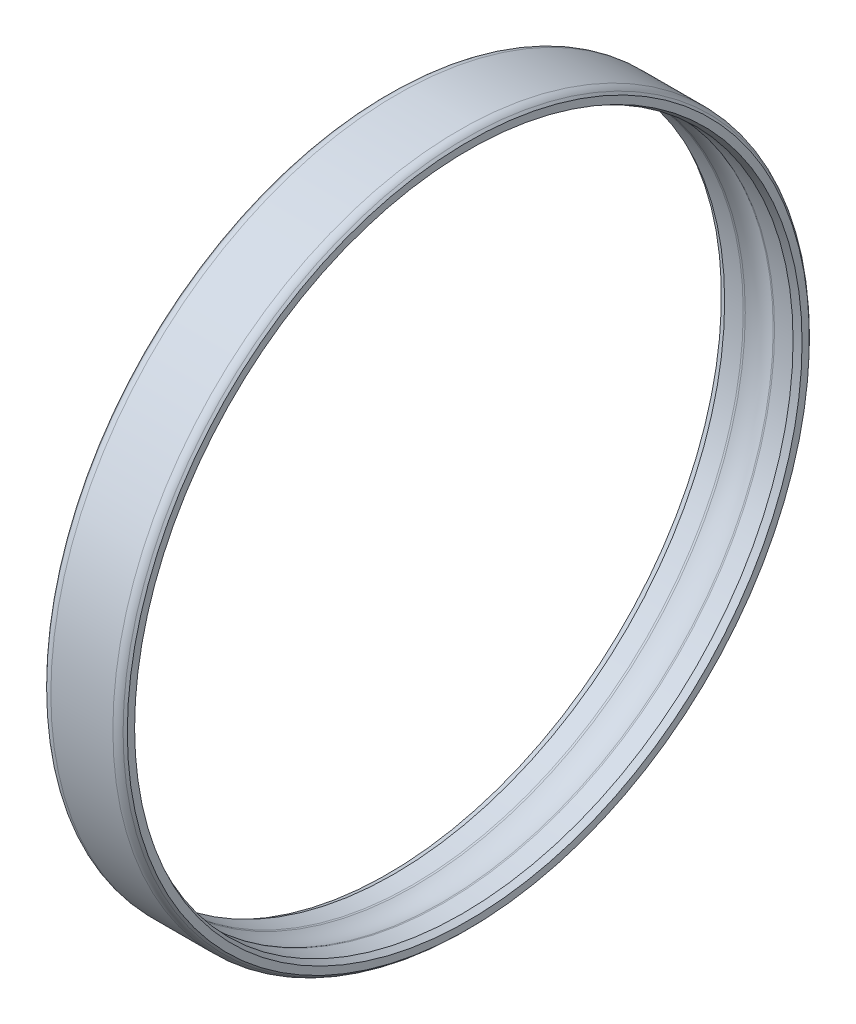
ISO-10303-21;
HEADER;
FILE_DESCRIPTION(('STEP AP214'),'2;1');
FILE_NAME('part.step','',(''),(''),'','','');
FILE_SCHEMA(('AUTOMOTIVE_DESIGN { 1 0 10303 214 1 1 1 1 }'));
ENDSEC;
DATA;
#1=APPLICATION_CONTEXT('core data for automotive mechanical design processes');
#2=APPLICATION_PROTOCOL_DEFINITION('international standard','automotive_design',2000,#1);
#3=PRODUCT_CONTEXT('',#1,'mechanical');
#4=PRODUCT('Part','Part','',(#3));
#5=PRODUCT_RELATED_PRODUCT_CATEGORY('part','',(#4));
#6=PRODUCT_DEFINITION_FORMATION('','',#4);
#7=PRODUCT_DEFINITION_CONTEXT('part definition',#1,'design');
#8=PRODUCT_DEFINITION('design','',#6,#7);
#9=PRODUCT_DEFINITION_SHAPE('','',#8);
#10=(LENGTH_UNIT() NAMED_UNIT(*) SI_UNIT(.MILLI.,.METRE.));
#11=(NAMED_UNIT(*) PLANE_ANGLE_UNIT() SI_UNIT($,.RADIAN.));
#12=(NAMED_UNIT(*) SI_UNIT($,.STERADIAN.) SOLID_ANGLE_UNIT());
#13=UNCERTAINTY_MEASURE_WITH_UNIT(LENGTH_MEASURE(1.E-05),#10,'distance_accuracy_value','');
#14=(GEOMETRIC_REPRESENTATION_CONTEXT(3) GLOBAL_UNCERTAINTY_ASSIGNED_CONTEXT((#13)) GLOBAL_UNIT_ASSIGNED_CONTEXT((#10,
#11,#12)) REPRESENTATION_CONTEXT('',''));
#15=CARTESIAN_POINT('',(0.,0.,0.));
#16=DIRECTION('',(0.,0.,1.));
#17=DIRECTION('',(1.,0.,0.));
#18=AXIS2_PLACEMENT_3D('',#15,#16,#17);
#19=CARTESIAN_POINT('',(1.975,0.,0.));
#20=DIRECTION('',(1.,0.,0.));
#21=DIRECTION('',(0.,0.,-1.));
#22=AXIS2_PLACEMENT_3D('',#19,#20,#21);
#23=CONICAL_SURFACE('',#22,16.3403922974465,0.436332312500002);
#24=CARTESIAN_POINT('',(1.975,0.,0.));
#25=DIRECTION('',(-1.,0.,0.));
#26=DIRECTION('',(0.,0.,1.));
#27=AXIS2_PLACEMENT_3D('',#24,#25,#26);
#28=CIRCLE('',#27,16.3403922974465);
#29=CARTESIAN_POINT('',(1.975,0.,16.3403922974465));
#30=VERTEX_POINT('',#29);
#31=EDGE_CURVE('E11',#30,#30,#28,.T.);
#32=ORIENTED_EDGE('',*,*,#31,.F.);
#33=EDGE_LOOP('',(#32));
#34=FACE_BOUND('',#33,.T.);
#35=CARTESIAN_POINT('',(1.675,0.,0.));
#36=DIRECTION('',(-1.,0.,0.));
#37=DIRECTION('',(0.,0.,-1.));
#38=AXIS2_PLACEMENT_3D('',#35,#36,#37);
#39=CIRCLE('',#38,16.2005);
#40=CARTESIAN_POINT('',(1.675,0.,-16.2005));
#41=VERTEX_POINT('',#40);
#42=EDGE_CURVE('E126',#41,#41,#39,.T.);
#43=ORIENTED_EDGE('',*,*,#42,.T.);
#44=EDGE_LOOP('',(#43));
#45=FACE_BOUND('',#44,.T.);
#46=ADVANCED_FACE('F17',(#34,#45),#23,.F.);
#47=CARTESIAN_POINT('',(1.975,16.698,0.));
#48=DIRECTION('',(1.,0.,0.));
#49=DIRECTION('',(0.,1.,0.));
#50=AXIS2_PLACEMENT_3D('',#47,#48,#49);
#51=PLANE('',#50);
#52=CARTESIAN_POINT('',(1.975,0.,0.));
#53=DIRECTION('',(-1.,0.,0.));
#54=DIRECTION('',(0.,0.,1.));
#55=AXIS2_PLACEMENT_3D('',#52,#53,#54);
#56=CIRCLE('',#55,16.698);
#57=CARTESIAN_POINT('',(1.975,0.,16.698));
#58=VERTEX_POINT('',#57);
#59=EDGE_CURVE('E20',#58,#58,#56,.T.);
#60=ORIENTED_EDGE('',*,*,#59,.F.);
#61=EDGE_LOOP('',(#60));
#62=FACE_BOUND('',#61,.T.);
#63=ORIENTED_EDGE('',*,*,#31,.T.);
#64=EDGE_LOOP('',(#63));
#65=FACE_BOUND('',#64,.T.);
#66=ADVANCED_FACE('F196',(#62,#65),#51,.T.);
#67=CARTESIAN_POINT('',(1.87144660940673,0.,0.));
#68=DIRECTION('',(-1.,0.,0.));
#69=DIRECTION('',(0.,0.,1.));
#70=AXIS2_PLACEMENT_3D('',#67,#68,#69);
#71=CONICAL_SURFACE('',#70,16.8015533905933,0.785398162500012);
#72=CARTESIAN_POINT('',(1.87144660940673,0.,0.));
#73=DIRECTION('',(-1.,0.,0.));
#74=DIRECTION('',(0.,0.,1.));
#75=AXIS2_PLACEMENT_3D('',#72,#73,#74);
#76=CIRCLE('',#75,16.8015533905933);
#77=CARTESIAN_POINT('',(1.87144660940673,0.,16.8015533905933));
#78=VERTEX_POINT('',#77);
#79=EDGE_CURVE('E95',#78,#78,#76,.T.);
#80=ORIENTED_EDGE('',*,*,#79,.F.);
#81=EDGE_LOOP('',(#80));
#82=FACE_BOUND('',#81,.T.);
#83=ORIENTED_EDGE('',*,*,#59,.T.);
#84=EDGE_LOOP('',(#83));
#85=FACE_BOUND('',#84,.T.);
#86=ADVANCED_FACE('F192',(#82,#85),#71,.T.);
#87=CARTESIAN_POINT('',(1.51789321881345,0.,0.));
#88=DIRECTION('',(-1.,0.,0.));
#89=DIRECTION('',(0.,0.,1.));
#90=AXIS2_PLACEMENT_3D('',#87,#88,#89);
#91=TOROIDAL_SURFACE('',#90,16.448,0.5);
#92=CARTESIAN_POINT('',(1.51789321881345,0.,0.));
#93=DIRECTION('',(-1.,0.,0.));
#94=DIRECTION('',(0.,0.,1.));
#95=AXIS2_PLACEMENT_3D('',#92,#93,#94);
#96=CIRCLE('',#95,16.948);
#97=CARTESIAN_POINT('',(1.51789321881345,0.,16.948));
#98=VERTEX_POINT('',#97);
#99=EDGE_CURVE('E91',#98,#98,#96,.T.);
#100=ORIENTED_EDGE('',*,*,#99,.F.);
#101=EDGE_LOOP('',(#100));
#102=FACE_BOUND('',#101,.T.);
#103=ORIENTED_EDGE('',*,*,#79,.T.);
#104=EDGE_LOOP('',(#103));
#105=FACE_BOUND('',#104,.T.);
#106=ADVANCED_FACE('F185',(#102,#105),#91,.T.);
#107=CARTESIAN_POINT('',(0.,0.,0.));
#108=DIRECTION('',(-1.,0.,0.));
#109=DIRECTION('',(0.,0.,1.));
#110=AXIS2_PLACEMENT_3D('',#107,#108,#109);
#111=CYLINDRICAL_SURFACE('',#110,16.948);
#112=CARTESIAN_POINT('',(-1.51789321881345,0.,0.));
#113=DIRECTION('',(-1.,0.,0.));
#114=DIRECTION('',(0.,0.,1.));
#115=AXIS2_PLACEMENT_3D('',#112,#113,#114);
#116=CIRCLE('',#115,16.948);
#117=CARTESIAN_POINT('',(-1.51789321881345,0.,16.948));
#118=VERTEX_POINT('',#117);
#119=EDGE_CURVE('E96',#118,#118,#116,.T.);
#120=ORIENTED_EDGE('',*,*,#119,.F.);
#121=EDGE_LOOP('',(#120));
#122=FACE_BOUND('',#121,.T.);
#123=ORIENTED_EDGE('',*,*,#99,.T.);
#124=EDGE_LOOP('',(#123));
#125=FACE_BOUND('',#124,.T.);
#126=ADVANCED_FACE('F92',(#122,#125),#111,.T.);
#127=CARTESIAN_POINT('',(-1.51789321881345,0.,0.));
#128=DIRECTION('',(-1.,0.,0.));
#129=DIRECTION('',(0.,0.,1.));
#130=AXIS2_PLACEMENT_3D('',#127,#128,#129);
#131=TOROIDAL_SURFACE('',#130,16.448,0.5);
#132=CARTESIAN_POINT('',(-1.87144660940673,0.,0.));
#133=DIRECTION('',(-1.,0.,0.));
#134=DIRECTION('',(0.,0.,1.));
#135=AXIS2_PLACEMENT_3D('',#132,#133,#134);
#136=CIRCLE('',#135,16.8015533905933);
#137=CARTESIAN_POINT('',(-1.87144660940673,0.,16.8015533905933));
#138=VERTEX_POINT('',#137);
#139=EDGE_CURVE('E102',#138,#138,#136,.T.);
#140=ORIENTED_EDGE('',*,*,#139,.F.);
#141=EDGE_LOOP('',(#140));
#142=FACE_BOUND('',#141,.T.);
#143=ORIENTED_EDGE('',*,*,#119,.T.);
#144=EDGE_LOOP('',(#143));
#145=FACE_BOUND('',#144,.T.);
#146=ADVANCED_FACE('F175',(#142,#145),#131,.T.);
#147=CARTESIAN_POINT('',(-1.975,0.,0.));
#148=DIRECTION('',(1.,0.,0.));
#149=DIRECTION('',(0.,0.,-1.));
#150=AXIS2_PLACEMENT_3D('',#147,#148,#149);
#151=CONICAL_SURFACE('',#150,16.698,0.7853981625);
#152=CARTESIAN_POINT('',(-1.975,0.,0.));
#153=DIRECTION('',(-1.,0.,0.));
#154=DIRECTION('',(0.,0.,1.));
#155=AXIS2_PLACEMENT_3D('',#152,#153,#154);
#156=CIRCLE('',#155,16.698);
#157=CARTESIAN_POINT('',(-1.975,0.,16.698));
#158=VERTEX_POINT('',#157);
#159=EDGE_CURVE('E107',#158,#158,#156,.T.);
#160=ORIENTED_EDGE('',*,*,#159,.F.);
#161=EDGE_LOOP('',(#160));
#162=FACE_BOUND('',#161,.T.);
#163=ORIENTED_EDGE('',*,*,#139,.T.);
#164=EDGE_LOOP('',(#163));
#165=FACE_BOUND('',#164,.T.);
#166=ADVANCED_FACE('F169',(#162,#165),#151,.T.);
#167=CARTESIAN_POINT('',(-1.975,16.3403922974465,0.));
#168=DIRECTION('',(-1.,0.,0.));
#169=DIRECTION('',(0.,0.,1.));
#170=AXIS2_PLACEMENT_3D('',#167,#168,#169);
#171=PLANE('',#170);
#172=CARTESIAN_POINT('',(-1.975,0.,0.));
#173=DIRECTION('',(-1.,0.,0.));
#174=DIRECTION('',(0.,0.,1.));
#175=AXIS2_PLACEMENT_3D('',#172,#173,#174);
#176=CIRCLE('',#175,16.3403922974465);
#177=CARTESIAN_POINT('',(-1.975,0.,16.3403922974465));
#178=VERTEX_POINT('',#177);
#179=EDGE_CURVE('E108',#178,#178,#176,.T.);
#180=ORIENTED_EDGE('',*,*,#179,.F.);
#181=EDGE_LOOP('',(#180));
#182=FACE_BOUND('',#181,.T.);
#183=ORIENTED_EDGE('',*,*,#159,.T.);
#184=EDGE_LOOP('',(#183));
#185=FACE_BOUND('',#184,.T.);
#186=ADVANCED_FACE('F163',(#182,#185),#171,.T.);
#187=CARTESIAN_POINT('',(-1.675,0.,0.));
#188=DIRECTION('',(-1.,0.,0.));
#189=DIRECTION('',(0.,0.,1.));
#190=AXIS2_PLACEMENT_3D('',#187,#188,#189);
#191=CONICAL_SURFACE('',#190,16.2005,0.436332312500002);
#192=CARTESIAN_POINT('',(-1.675,0.,0.));
#193=DIRECTION('',(-1.,0.,0.));
#194=DIRECTION('',(0.,0.,1.));
#195=AXIS2_PLACEMENT_3D('',#192,#193,#194);
#196=CIRCLE('',#195,16.2005);
#197=CARTESIAN_POINT('',(-1.675,0.,16.2005));
#198=VERTEX_POINT('',#197);
#199=EDGE_CURVE('E111',#198,#198,#196,.T.);
#200=ORIENTED_EDGE('',*,*,#199,.F.);
#201=EDGE_LOOP('',(#200));
#202=FACE_BOUND('',#201,.T.);
#203=ORIENTED_EDGE('',*,*,#179,.T.);
#204=EDGE_LOOP('',(#203));
#205=FACE_BOUND('',#204,.T.);
#206=ADVANCED_FACE('F157',(#202,#205),#191,.F.);
#207=CARTESIAN_POINT('',(0.,0.,0.));
#208=DIRECTION('',(-1.,0.,0.));
#209=DIRECTION('',(0.,0.,1.));
#210=AXIS2_PLACEMENT_3D('',#207,#208,#209);
#211=CYLINDRICAL_SURFACE('',#210,16.2005);
#212=CARTESIAN_POINT('',(-0.765881844673186,0.,0.));
#213=DIRECTION('',(-1.,0.,0.));
#214=DIRECTION('',(0.,0.,1.));
#215=AXIS2_PLACEMENT_3D('',#212,#213,#214);
#216=CIRCLE('',#215,16.2005);
#217=CARTESIAN_POINT('',(-0.765881844673186,0.,16.2005));
#218=VERTEX_POINT('',#217);
#219=EDGE_CURVE('E114',#218,#218,#216,.T.);
#220=ORIENTED_EDGE('',*,*,#219,.F.);
#221=EDGE_LOOP('',(#220));
#222=FACE_BOUND('',#221,.T.);
#223=ORIENTED_EDGE('',*,*,#199,.T.);
#224=EDGE_LOOP('',(#223));
#225=FACE_BOUND('',#224,.T.);
#226=ADVANCED_FACE('F151',(#222,#225),#211,.F.);
#227=CARTESIAN_POINT('',(-0.765881844673186,0.,0.));
#228=DIRECTION('',(-1.,0.,0.));
#229=DIRECTION('',(0.,0.,1.));
#230=AXIS2_PLACEMENT_3D('',#227,#228,#229);
#231=TOROIDAL_SURFACE('',#230,16.4005,0.2);
#232=CARTESIAN_POINT('',(-0.683528958149188,0.,0.));
#233=DIRECTION('',(-1.,0.,0.));
#234=DIRECTION('',(0.,0.,1.));
#235=AXIS2_PLACEMENT_3D('',#232,#233,#234);
#236=CIRCLE('',#235,16.2182419354839);
#237=CARTESIAN_POINT('',(-0.683528958149188,0.,16.2182419354839));
#238=VERTEX_POINT('',#237);
#239=EDGE_CURVE('E116',#238,#238,#236,.T.);
#240=ORIENTED_EDGE('',*,*,#239,.F.);
#241=EDGE_LOOP('',(#240));
#242=FACE_BOUND('',#241,.T.);
#243=ORIENTED_EDGE('',*,*,#219,.T.);
#244=EDGE_LOOP('',(#243));
#245=FACE_BOUND('',#244,.T.);
#246=ADVANCED_FACE('F145',(#242,#245),#231,.T.);
#247=CARTESIAN_POINT('',(0.,0.,0.));
#248=DIRECTION('',(-1.,0.,0.));
#249=DIRECTION('',(0.,0.,1.));
#250=AXIS2_PLACEMENT_3D('',#247,#248,#249);
#251=TOROIDAL_SURFACE('',#250,14.7055,1.66);
#252=CARTESIAN_POINT('',(0.683528958149188,0.,0.));
#253=DIRECTION('',(-1.,0.,0.));
#254=DIRECTION('',(0.,0.,1.));
#255=AXIS2_PLACEMENT_3D('',#252,#253,#254);
#256=CIRCLE('',#255,16.2182419354839);
#257=CARTESIAN_POINT('',(0.683528958149188,0.,16.2182419354839));
#258=VERTEX_POINT('',#257);
#259=EDGE_CURVE('E120',#258,#258,#256,.T.);
#260=ORIENTED_EDGE('',*,*,#259,.F.);
#261=EDGE_LOOP('',(#260));
#262=FACE_BOUND('',#261,.T.);
#263=ORIENTED_EDGE('',*,*,#239,.T.);
#264=EDGE_LOOP('',(#263));
#265=FACE_BOUND('',#264,.T.);
#266=ADVANCED_FACE('F139',(#262,#265),#251,.F.);
#267=CARTESIAN_POINT('',(0.765881844673186,0.,0.));
#268=DIRECTION('',(-1.,0.,0.));
#269=DIRECTION('',(0.,0.,1.));
#270=AXIS2_PLACEMENT_3D('',#267,#268,#269);
#271=TOROIDAL_SURFACE('',#270,16.4005,0.2);
#272=CARTESIAN_POINT('',(0.765881844673186,0.,0.));
#273=DIRECTION('',(-1.,0.,0.));
#274=DIRECTION('',(0.,0.,1.));
#275=AXIS2_PLACEMENT_3D('',#272,#273,#274);
#276=CIRCLE('',#275,16.2005);
#277=CARTESIAN_POINT('',(0.765881844673186,0.,16.2005));
#278=VERTEX_POINT('',#277);
#279=EDGE_CURVE('E123',#278,#278,#276,.T.);
#280=ORIENTED_EDGE('',*,*,#279,.F.);
#281=EDGE_LOOP('',(#280));
#282=FACE_BOUND('',#281,.T.);
#283=ORIENTED_EDGE('',*,*,#259,.T.);
#284=EDGE_LOOP('',(#283));
#285=FACE_BOUND('',#284,.T.);
#286=ADVANCED_FACE('F136',(#282,#285),#271,.T.);
#287=CARTESIAN_POINT('',(0.,0.,0.));
#288=DIRECTION('',(-1.,0.,0.));
#289=DIRECTION('',(0.,0.,1.));
#290=AXIS2_PLACEMENT_3D('',#287,#288,#289);
#291=CYLINDRICAL_SURFACE('',#290,16.2005);
#292=ORIENTED_EDGE('',*,*,#279,.T.);
#293=EDGE_LOOP('',(#292));
#294=FACE_BOUND('',#293,.T.);
#295=ORIENTED_EDGE('',*,*,#42,.F.);
#296=EDGE_LOOP('',(#295));
#297=FACE_BOUND('',#296,.T.);
#298=ADVANCED_FACE('F133',(#294,#297),#291,.F.);
#299=CLOSED_SHELL('',(#46,#66,#86,#106,#126,#146,#166,#186,#206,#226,#246,#266,#286,#298));
#300=MANIFOLD_SOLID_BREP('B1',#299);
#301=ADVANCED_BREP_SHAPE_REPRESENTATION('',(#18,#300),#14);
#302=SHAPE_DEFINITION_REPRESENTATION(#9,#301);
ENDSEC;
END-ISO-10303-21;
